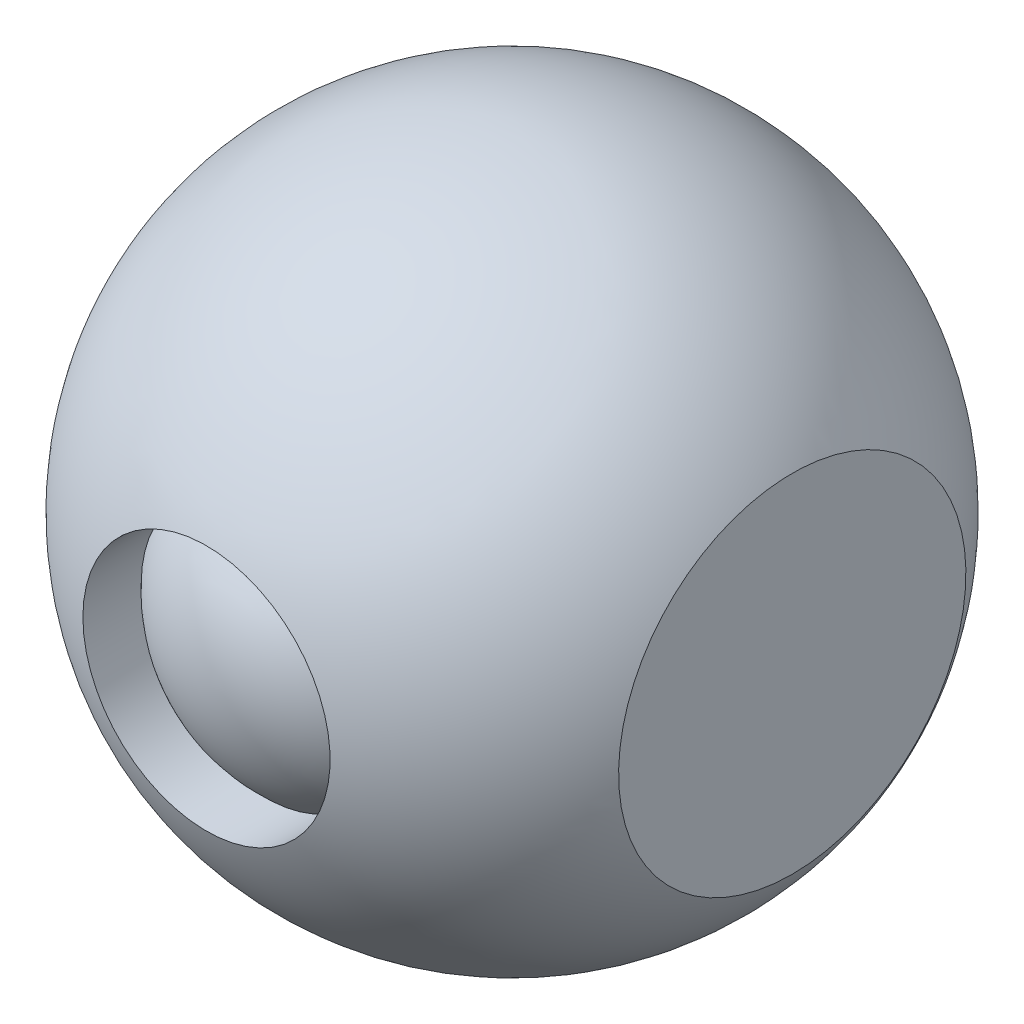
ISO-10303-21;
HEADER;
FILE_DESCRIPTION(('STEP AP214'),'2;1');
FILE_NAME('part.step','',(''),(''),'','','');
FILE_SCHEMA(('AUTOMOTIVE_DESIGN { 1 0 10303 214 1 1 1 1 }'));
ENDSEC;
DATA;
#1=APPLICATION_CONTEXT('core data for automotive mechanical design processes');
#2=APPLICATION_PROTOCOL_DEFINITION('international standard','automotive_design',2000,#1);
#3=PRODUCT_CONTEXT('',#1,'mechanical');
#4=PRODUCT('Part','Part','',(#3));
#5=PRODUCT_RELATED_PRODUCT_CATEGORY('part','',(#4));
#6=PRODUCT_DEFINITION_FORMATION('','',#4);
#7=PRODUCT_DEFINITION_CONTEXT('part definition',#1,'design');
#8=PRODUCT_DEFINITION('design','',#6,#7);
#9=PRODUCT_DEFINITION_SHAPE('','',#8);
#10=(LENGTH_UNIT() NAMED_UNIT(*) SI_UNIT(.MILLI.,.METRE.));
#11=(NAMED_UNIT(*) PLANE_ANGLE_UNIT() SI_UNIT($,.RADIAN.));
#12=(NAMED_UNIT(*) SI_UNIT($,.STERADIAN.) SOLID_ANGLE_UNIT());
#13=UNCERTAINTY_MEASURE_WITH_UNIT(LENGTH_MEASURE(1.E-05),#10,'distance_accuracy_value','');
#14=(GEOMETRIC_REPRESENTATION_CONTEXT(3) GLOBAL_UNCERTAINTY_ASSIGNED_CONTEXT((#13)) GLOBAL_UNIT_ASSIGNED_CONTEXT((#10,
#11,#12)) REPRESENTATION_CONTEXT('',''));
#15=CARTESIAN_POINT('',(0.,0.,0.));
#16=DIRECTION('',(0.,0.,1.));
#17=DIRECTION('',(1.,0.,0.));
#18=AXIS2_PLACEMENT_3D('',#15,#16,#17);
#19=CARTESIAN_POINT('',(0.,0.,0.));
#20=DIRECTION('',(-1.,0.,0.));
#21=DIRECTION('',(0.,1.,0.));
#22=AXIS2_PLACEMENT_3D('',#19,#20,#21);
#23=SPHERICAL_SURFACE('',#22,60.);
#24=CARTESIAN_POINT('',(-51.,0.,0.));
#25=DIRECTION('',(-1.,0.,0.));
#26=DIRECTION('',(0.,-1.,0.));
#27=AXIS2_PLACEMENT_3D('',#24,#25,#26);
#28=CIRCLE('',#27,31.6069612585582);
#29=CARTESIAN_POINT('',(-51.,-31.6069612585582,0.));
#30=VERTEX_POINT('',#29);
#31=EDGE_CURVE('E44',#30,#30,#28,.T.);
#32=ORIENTED_EDGE('',*,*,#31,.F.);
#33=EDGE_LOOP('',(#32));
#34=FACE_BOUND('',#33,.T.);
#35=CARTESIAN_POINT('',(51.,0.,0.));
#36=DIRECTION('',(-1.,0.,0.));
#37=DIRECTION('',(0.,-1.,0.));
#38=AXIS2_PLACEMENT_3D('',#35,#36,#37);
#39=CIRCLE('',#38,31.6069612585582);
#40=CARTESIAN_POINT('',(51.,-31.6069612585582,0.));
#41=VERTEX_POINT('',#40);
#42=EDGE_CURVE('E40',#41,#41,#39,.T.);
#43=ORIENTED_EDGE('',*,*,#42,.T.);
#44=EDGE_LOOP('',(#43));
#45=FACE_BOUND('',#44,.T.);
#46=CARTESIAN_POINT('',(0.,0.,55.6214886532175));
#47=DIRECTION('',(0.,0.,-1.));
#48=DIRECTION('',(-1.,0.,0.));
#49=AXIS2_PLACEMENT_3D('',#46,#47,#48);
#50=CIRCLE('',#49,22.5);
#51=CARTESIAN_POINT('',(-22.5,0.,55.6214886532175));
#52=VERTEX_POINT('',#51);
#53=EDGE_CURVE('E48',#52,#52,#50,.T.);
#54=ORIENTED_EDGE('',*,*,#53,.T.);
#55=EDGE_LOOP('',(#54));
#56=FACE_BOUND('',#55,.T.);
#57=ADVANCED_FACE('F33',(#34,#45,#56),#23,.T.);
#58=CARTESIAN_POINT('',(51.,0.,0.));
#59=DIRECTION('',(-1.,0.,0.));
#60=DIRECTION('',(0.,-1.,0.));
#61=AXIS2_PLACEMENT_3D('',#58,#59,#60);
#62=PLANE('',#61);
#63=ORIENTED_EDGE('',*,*,#42,.F.);
#64=EDGE_LOOP('',(#63));
#65=FACE_BOUND('',#64,.T.);
#66=ADVANCED_FACE('F66',(#65),#62,.F.);
#67=CARTESIAN_POINT('',(-51.,0.,0.));
#68=DIRECTION('',(1.,0.,0.));
#69=DIRECTION('',(0.,1.,0.));
#70=AXIS2_PLACEMENT_3D('',#67,#68,#69);
#71=PLANE('',#70);
#72=ORIENTED_EDGE('',*,*,#31,.T.);
#73=EDGE_LOOP('',(#72));
#74=FACE_BOUND('',#73,.T.);
#75=ADVANCED_FACE('F57',(#74),#71,.F.);
#76=CARTESIAN_POINT('',(0.,0.,60.001));
#77=DIRECTION('',(0.,0.,-1.));
#78=DIRECTION('',(-1.,0.,0.));
#79=AXIS2_PLACEMENT_3D('',#76,#77,#78);
#80=CYLINDRICAL_SURFACE('',#79,22.5);
#81=CARTESIAN_POINT('',(0.,0.,45.));
#82=DIRECTION('',(0.,0.,1.));
#83=DIRECTION('',(1.,0.,0.));
#84=AXIS2_PLACEMENT_3D('',#81,#82,#83);
#85=CIRCLE('',#84,22.5);
#86=CARTESIAN_POINT('',(22.5,0.,45.));
#87=VERTEX_POINT('',#86);
#88=EDGE_CURVE('E10',#87,#87,#85,.T.);
#89=ORIENTED_EDGE('',*,*,#88,.F.);
#90=EDGE_LOOP('',(#89));
#91=FACE_BOUND('',#90,.T.);
#92=ORIENTED_EDGE('',*,*,#53,.F.);
#93=EDGE_LOOP('',(#92));
#94=FACE_BOUND('',#93,.T.);
#95=ADVANCED_FACE('F55',(#91,#94),#80,.F.);
#96=CARTESIAN_POINT('',(0.,0.,24.6875));
#97=DIRECTION('',(0.,0.,1.));
#98=DIRECTION('',(1.,0.,0.));
#99=AXIS2_PLACEMENT_3D('',#96,#97,#98);
#100=SPHERICAL_SURFACE('',#99,30.3125);
#101=ORIENTED_EDGE('',*,*,#88,.T.);
#102=EDGE_LOOP('',(#101));
#103=FACE_BOUND('',#102,.T.);
#104=ADVANCED_FACE('F35',(#103),#100,.T.);
#105=CLOSED_SHELL('',(#57,#66,#75,#95,#104));
#106=MANIFOLD_SOLID_BREP('B2',#105);
#107=ADVANCED_BREP_SHAPE_REPRESENTATION('',(#18,#106),#14);
#108=SHAPE_DEFINITION_REPRESENTATION(#9,#107);
ENDSEC;
END-ISO-10303-21;
